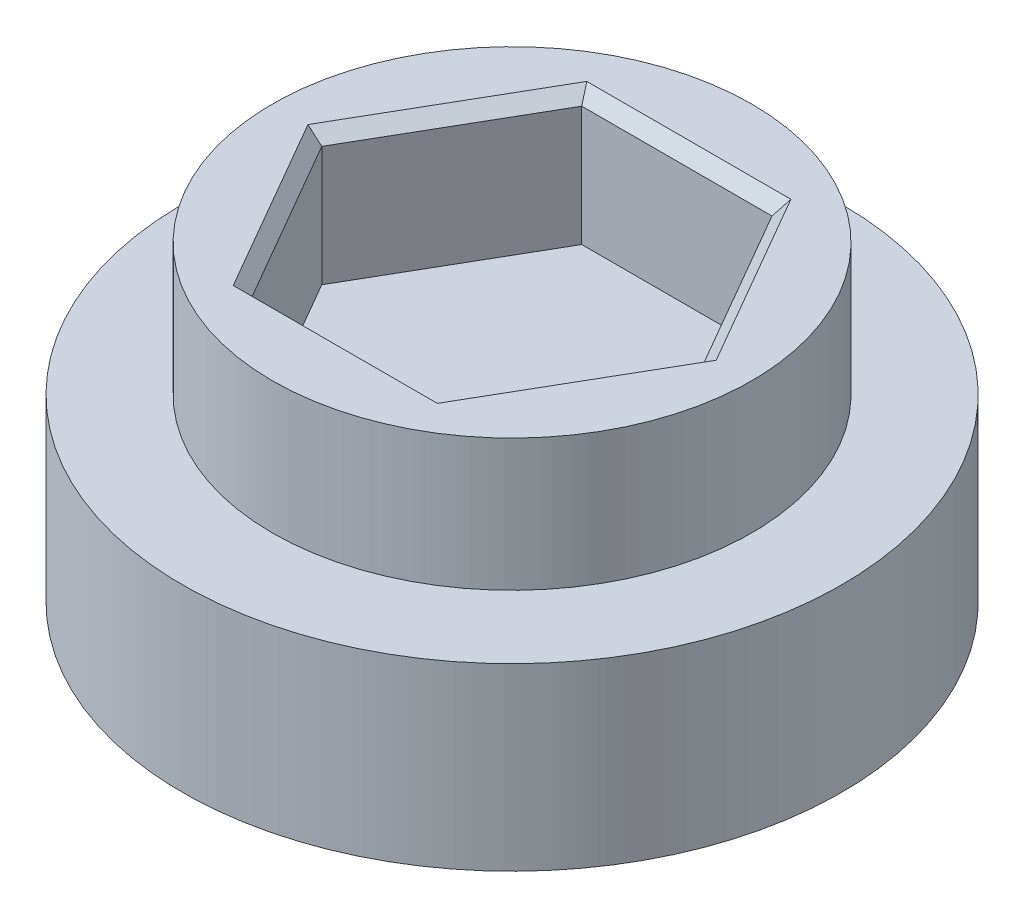
ISO-10303-21;
HEADER;
FILE_DESCRIPTION(('STEP AP214'),'2;1');
FILE_NAME('part.step','',(''),(''),'','','');
FILE_SCHEMA(('AUTOMOTIVE_DESIGN { 1 0 10303 214 1 1 1 1 }'));
ENDSEC;
DATA;
#1=APPLICATION_CONTEXT('core data for automotive mechanical design processes');
#2=APPLICATION_PROTOCOL_DEFINITION('international standard','automotive_design',2000,#1);
#3=PRODUCT_CONTEXT('',#1,'mechanical');
#4=PRODUCT('Part','Part','',(#3));
#5=PRODUCT_RELATED_PRODUCT_CATEGORY('part','',(#4));
#6=PRODUCT_DEFINITION_FORMATION('','',#4);
#7=PRODUCT_DEFINITION_CONTEXT('part definition',#1,'design');
#8=PRODUCT_DEFINITION('design','',#6,#7);
#9=PRODUCT_DEFINITION_SHAPE('','',#8);
#10=(LENGTH_UNIT() NAMED_UNIT(*) SI_UNIT(.MILLI.,.METRE.));
#11=(NAMED_UNIT(*) PLANE_ANGLE_UNIT() SI_UNIT($,.RADIAN.));
#12=(NAMED_UNIT(*) SI_UNIT($,.STERADIAN.) SOLID_ANGLE_UNIT());
#13=UNCERTAINTY_MEASURE_WITH_UNIT(LENGTH_MEASURE(1.E-05),#10,'distance_accuracy_value','');
#14=(GEOMETRIC_REPRESENTATION_CONTEXT(3) GLOBAL_UNCERTAINTY_ASSIGNED_CONTEXT((#13)) GLOBAL_UNIT_ASSIGNED_CONTEXT((#10,
#11,#12)) REPRESENTATION_CONTEXT('',''));
#15=CARTESIAN_POINT('',(0.,0.,0.));
#16=DIRECTION('',(0.,0.,1.));
#17=DIRECTION('',(1.,0.,0.));
#18=AXIS2_PLACEMENT_3D('',#15,#16,#17);
#19=CARTESIAN_POINT('',(0.,22.,0.));
#20=DIRECTION('',(0.,1.,0.));
#21=DIRECTION('',(0.,0.,1.));
#22=AXIS2_PLACEMENT_3D('',#19,#20,#21);
#23=PLANE('',#22);
#24=DIRECTION('',(-1.,0.,0.));
#25=VECTOR('',#24,1.);
#26=CARTESIAN_POINT('',(1.45041645805347E-13,22.,29.4999999999999));
#27=LINE('',#26,#25);
#28=CARTESIAN_POINT('',(17.0318329410947,22.,29.4999999999999));
#29=VERTEX_POINT('',#28);
#30=CARTESIAN_POINT('',(-17.0318329410941,22.,29.5));
#31=VERTEX_POINT('',#30);
#32=EDGE_CURVE('E153',#29,#31,#27,.T.);
#33=ORIENTED_EDGE('',*,*,#32,.T.);
#34=DIRECTION('',(-0.499999999999992,0.,-0.866025403784443));
#35=VECTOR('',#34,1.);
#36=CARTESIAN_POINT('',(-25.5477494116411,22.,14.7499999999998));
#37=LINE('',#36,#35);
#38=CARTESIAN_POINT('',(-34.063665882188,22.,-3.58368572086117E-13));
#39=VERTEX_POINT('',#38);
#40=EDGE_CURVE('E155',#31,#39,#37,.T.);
#41=ORIENTED_EDGE('',*,*,#40,.T.);
#42=DIRECTION('',(0.50000000000001,0.,-0.866025403784433));
#43=VECTOR('',#42,1.);
#44=CARTESIAN_POINT('',(-25.5477494116408,22.,-14.7500000000003));
#45=LINE('',#44,#43);
#46=CARTESIAN_POINT('',(-17.0318329410937,22.,-29.5));
#47=VERTEX_POINT('',#46);
#48=EDGE_CURVE('E145',#39,#47,#45,.T.);
#49=ORIENTED_EDGE('',*,*,#48,.T.);
#50=DIRECTION('',(1.,0.,0.));
#51=VECTOR('',#50,1.);
#52=CARTESIAN_POINT('',(0.,22.,-29.5));
#53=LINE('',#52,#51);
#54=CARTESIAN_POINT('',(17.031832941094,22.,-29.5));
#55=VERTEX_POINT('',#54);
#56=EDGE_CURVE('E147',#47,#55,#53,.T.);
#57=ORIENTED_EDGE('',*,*,#56,.T.);
#58=DIRECTION('',(0.499999999999988,0.,0.866025403784446));
#59=VECTOR('',#58,1.);
#60=CARTESIAN_POINT('',(25.547749411641,22.,-14.7499999999995));
#61=LINE('',#60,#59);
#62=CARTESIAN_POINT('',(34.0636658821873,22.,-2.71746413941701E-13));
#63=VERTEX_POINT('',#62);
#64=EDGE_CURVE('E149',#55,#63,#61,.T.);
#65=ORIENTED_EDGE('',*,*,#64,.T.);
#66=DIRECTION('',(-0.499999999999968,0.,0.866025403784457));
#67=VECTOR('',#66,1.);
#68=CARTESIAN_POINT('',(25.5477494116414,22.,14.749999999999));
#69=LINE('',#68,#67);
#70=EDGE_CURVE('E151',#63,#29,#69,.T.);
#71=ORIENTED_EDGE('',*,*,#70,.T.);
#72=EDGE_LOOP('',(#33,#41,#49,#57,#65,#71));
#73=FACE_BOUND('',#72,.T.);
#74=CARTESIAN_POINT('',(0.,22.,0.));
#75=DIRECTION('',(0.,1.,0.));
#76=DIRECTION('',(0.,0.,1.));
#77=AXIS2_PLACEMENT_3D('',#74,#75,#76);
#78=CIRCLE('',#77,40.);
#79=CARTESIAN_POINT('',(0.,22.,40.));
#80=VERTEX_POINT('',#79);
#81=EDGE_CURVE('E139',#80,#80,#78,.T.);
#82=ORIENTED_EDGE('',*,*,#81,.T.);
#83=EDGE_LOOP('',(#82));
#84=FACE_BOUND('',#83,.T.);
#85=ADVANCED_FACE('F32',(#73,#84),#23,.T.);
#86=CARTESIAN_POINT('',(0.,22.,0.));
#87=DIRECTION('',(0.,-1.,0.));
#88=DIRECTION('',(0.,0.,-1.));
#89=AXIS2_PLACEMENT_3D('',#86,#87,#88);
#90=CYLINDRICAL_SURFACE('',#89,40.);
#91=ORIENTED_EDGE('',*,*,#81,.F.);
#92=EDGE_LOOP('',(#91));
#93=FACE_BOUND('',#92,.T.);
#94=CARTESIAN_POINT('',(0.,0.,0.));
#95=DIRECTION('',(0.,-1.,0.));
#96=DIRECTION('',(0.,0.,-1.));
#97=AXIS2_PLACEMENT_3D('',#94,#95,#96);
#98=CIRCLE('',#97,40.);
#99=CARTESIAN_POINT('',(0.,0.,-40.));
#100=VERTEX_POINT('',#99);
#101=EDGE_CURVE('E167',#100,#100,#98,.T.);
#102=ORIENTED_EDGE('',*,*,#101,.F.);
#103=EDGE_LOOP('',(#102));
#104=FACE_BOUND('',#103,.T.);
#105=ADVANCED_FACE('F221',(#93,#104),#90,.T.);
#106=CARTESIAN_POINT('',(-31.7542648054294,22.,-3.24393290007663E-13));
#107=DIRECTION('',(0.866025403784433,0.,0.50000000000001));
#108=DIRECTION('',(0.50000000000001,0.,-0.866025403784433));
#109=AXIS2_PLACEMENT_3D('',#106,#107,#108);
#110=PLANE('',#109);
#111=DIRECTION('',(0.,-1.,0.));
#112=VECTOR('',#111,1.);
#113=CARTESIAN_POINT('',(-15.8771324027145,22.,-27.5));
#114=LINE('',#113,#112);
#115=CARTESIAN_POINT('',(-15.8771324027145,20.,-27.5));
#116=VERTEX_POINT('',#115);
#117=CARTESIAN_POINT('',(-15.8771324027145,0.,-27.5));
#118=VERTEX_POINT('',#117);
#119=EDGE_CURVE('E106',#116,#118,#114,.T.);
#120=ORIENTED_EDGE('',*,*,#119,.F.);
#121=DIRECTION('',(-0.50000000000001,0.,0.866025403784433));
#122=VECTOR('',#121,1.);
#123=CARTESIAN_POINT('',(-31.7542648054294,20.,-3.24393290007663E-13));
#124=LINE('',#123,#122);
#125=CARTESIAN_POINT('',(-31.7542648054294,20.,-3.24393290007663E-13));
#126=VERTEX_POINT('',#125);
#127=EDGE_CURVE('E11',#116,#126,#124,.T.);
#128=ORIENTED_EDGE('',*,*,#127,.T.);
#129=DIRECTION('',(0.,-1.,0.));
#130=VECTOR('',#129,1.);
#131=CARTESIAN_POINT('',(-31.7542648054294,22.,-3.24393290007663E-13));
#132=LINE('',#131,#130);
#133=CARTESIAN_POINT('',(-31.7542648054294,0.,-3.24393290007663E-13));
#134=VERTEX_POINT('',#133);
#135=EDGE_CURVE('E109',#126,#134,#132,.T.);
#136=ORIENTED_EDGE('',*,*,#135,.T.);
#137=DIRECTION('',(-0.50000000000001,0.,0.866025403784433));
#138=VECTOR('',#137,1.);
#139=CARTESIAN_POINT('',(-31.7542648054294,0.,-3.24393290007663E-13));
#140=LINE('',#139,#138);
#141=EDGE_CURVE('E104',#118,#134,#140,.T.);
#142=ORIENTED_EDGE('',*,*,#141,.F.);
#143=EDGE_LOOP('',(#120,#128,#136,#142));
#144=FACE_BOUND('',#143,.T.);
#145=ADVANCED_FACE('F105',(#144),#110,.T.);
#146=CARTESIAN_POINT('',(-15.8771324027149,22.,27.5));
#147=DIRECTION('',(0.866025403784443,0.,-0.499999999999992));
#148=DIRECTION('',(-0.499999999999992,0.,-0.866025403784443));
#149=AXIS2_PLACEMENT_3D('',#146,#147,#148);
#150=PLANE('',#149);
#151=ORIENTED_EDGE('',*,*,#135,.F.);
#152=DIRECTION('',(0.499999999999992,0.,0.866025403784443));
#153=VECTOR('',#152,1.);
#154=CARTESIAN_POINT('',(-15.8771324027149,20.,27.5));
#155=LINE('',#154,#153);
#156=CARTESIAN_POINT('',(-15.8771324027149,20.,27.5));
#157=VERTEX_POINT('',#156);
#158=EDGE_CURVE('E142',#126,#157,#155,.T.);
#159=ORIENTED_EDGE('',*,*,#158,.T.);
#160=DIRECTION('',(0.,-1.,0.));
#161=VECTOR('',#160,1.);
#162=CARTESIAN_POINT('',(-15.8771324027149,22.,27.5));
#163=LINE('',#162,#161);
#164=CARTESIAN_POINT('',(-15.8771324027149,0.,27.5));
#165=VERTEX_POINT('',#164);
#166=EDGE_CURVE('E136',#157,#165,#163,.T.);
#167=ORIENTED_EDGE('',*,*,#166,.T.);
#168=DIRECTION('',(0.499999999999992,0.,0.866025403784443));
#169=VECTOR('',#168,1.);
#170=CARTESIAN_POINT('',(-15.8771324027149,0.,27.5));
#171=LINE('',#170,#169);
#172=EDGE_CURVE('E114',#134,#165,#171,.T.);
#173=ORIENTED_EDGE('',*,*,#172,.F.);
#174=EDGE_LOOP('',(#151,#159,#167,#173));
#175=FACE_BOUND('',#174,.T.);
#176=ADVANCED_FACE('F198',(#175),#150,.T.);
#177=CARTESIAN_POINT('',(15.8771324027154,22.,27.4999999999998));
#178=DIRECTION('',(0.,0.,-1.));
#179=DIRECTION('',(-1.,0.,0.));
#180=AXIS2_PLACEMENT_3D('',#177,#178,#179);
#181=PLANE('',#180);
#182=ORIENTED_EDGE('',*,*,#166,.F.);
#183=DIRECTION('',(1.,0.,0.));
#184=VECTOR('',#183,1.);
#185=CARTESIAN_POINT('',(15.8771324027154,20.,27.4999999999998));
#186=LINE('',#185,#184);
#187=CARTESIAN_POINT('',(15.8771324027154,20.,27.4999999999998));
#188=VERTEX_POINT('',#187);
#189=EDGE_CURVE('E158',#157,#188,#186,.T.);
#190=ORIENTED_EDGE('',*,*,#189,.T.);
#191=DIRECTION('',(0.,-1.,0.));
#192=VECTOR('',#191,1.);
#193=CARTESIAN_POINT('',(15.8771324027154,22.,27.4999999999998));
#194=LINE('',#193,#192);
#195=CARTESIAN_POINT('',(15.8771324027154,0.,27.4999999999998));
#196=VERTEX_POINT('',#195);
#197=EDGE_CURVE('E134',#188,#196,#194,.T.);
#198=ORIENTED_EDGE('',*,*,#197,.T.);
#199=DIRECTION('',(1.,0.,0.));
#200=VECTOR('',#199,1.);
#201=CARTESIAN_POINT('',(15.8771324027154,0.,27.4999999999998));
#202=LINE('',#201,#200);
#203=EDGE_CURVE('E202',#165,#196,#202,.T.);
#204=ORIENTED_EDGE('',*,*,#203,.F.);
#205=EDGE_LOOP('',(#182,#190,#198,#204));
#206=FACE_BOUND('',#205,.T.);
#207=ADVANCED_FACE('F218',(#206),#181,.T.);
#208=CARTESIAN_POINT('',(31.7542648054288,22.,-2.39483014813458E-13));
#209=DIRECTION('',(-0.866025403784457,0.,-0.499999999999968));
#210=DIRECTION('',(-0.499999999999968,0.,0.866025403784457));
#211=AXIS2_PLACEMENT_3D('',#208,#209,#210);
#212=PLANE('',#211);
#213=ORIENTED_EDGE('',*,*,#197,.F.);
#214=DIRECTION('',(0.499999999999968,0.,-0.866025403784457));
#215=VECTOR('',#214,1.);
#216=CARTESIAN_POINT('',(31.7542648054288,20.,-2.39483014813458E-13));
#217=LINE('',#216,#215);
#218=CARTESIAN_POINT('',(31.7542648054288,20.,-2.39483014813458E-13));
#219=VERTEX_POINT('',#218);
#220=EDGE_CURVE('E160',#188,#219,#217,.T.);
#221=ORIENTED_EDGE('',*,*,#220,.T.);
#222=DIRECTION('',(0.,-1.,0.));
#223=VECTOR('',#222,1.);
#224=CARTESIAN_POINT('',(31.7542648054288,22.,-2.39483014813458E-13));
#225=LINE('',#224,#223);
#226=CARTESIAN_POINT('',(31.7542648054288,0.,-2.39483014813458E-13));
#227=VERTEX_POINT('',#226);
#228=EDGE_CURVE('E132',#219,#227,#225,.T.);
#229=ORIENTED_EDGE('',*,*,#228,.T.);
#230=DIRECTION('',(0.499999999999968,0.,-0.866025403784457));
#231=VECTOR('',#230,1.);
#232=CARTESIAN_POINT('',(31.7542648054288,0.,-2.39483014813458E-13));
#233=LINE('',#232,#231);
#234=EDGE_CURVE('E127',#196,#227,#233,.T.);
#235=ORIENTED_EDGE('',*,*,#234,.F.);
#236=EDGE_LOOP('',(#213,#221,#229,#235));
#237=FACE_BOUND('',#236,.T.);
#238=ADVANCED_FACE('F209',(#237),#212,.T.);
#239=CARTESIAN_POINT('',(15.8771324027147,22.,-27.5));
#240=DIRECTION('',(-0.866025403784446,0.,0.499999999999988));
#241=DIRECTION('',(0.499999999999988,0.,0.866025403784446));
#242=AXIS2_PLACEMENT_3D('',#239,#240,#241);
#243=PLANE('',#242);
#244=ORIENTED_EDGE('',*,*,#228,.F.);
#245=DIRECTION('',(-0.499999999999988,0.,-0.866025403784446));
#246=VECTOR('',#245,1.);
#247=CARTESIAN_POINT('',(15.8771324027147,20.,-27.5));
#248=LINE('',#247,#246);
#249=CARTESIAN_POINT('',(15.8771324027147,20.,-27.5));
#250=VERTEX_POINT('',#249);
#251=EDGE_CURVE('E56',#219,#250,#248,.T.);
#252=ORIENTED_EDGE('',*,*,#251,.T.);
#253=DIRECTION('',(0.,-1.,0.));
#254=VECTOR('',#253,1.);
#255=CARTESIAN_POINT('',(15.8771324027147,22.,-27.5));
#256=LINE('',#255,#254);
#257=CARTESIAN_POINT('',(15.8771324027147,0.,-27.5));
#258=VERTEX_POINT('',#257);
#259=EDGE_CURVE('E120',#250,#258,#256,.T.);
#260=ORIENTED_EDGE('',*,*,#259,.T.);
#261=DIRECTION('',(-0.499999999999988,0.,-0.866025403784446));
#262=VECTOR('',#261,1.);
#263=CARTESIAN_POINT('',(15.8771324027147,0.,-27.5));
#264=LINE('',#263,#262);
#265=EDGE_CURVE('E125',#227,#258,#264,.T.);
#266=ORIENTED_EDGE('',*,*,#265,.F.);
#267=EDGE_LOOP('',(#244,#252,#260,#266));
#268=FACE_BOUND('',#267,.T.);
#269=ADVANCED_FACE('F210',(#268),#243,.T.);
#270=CARTESIAN_POINT('',(-15.8771324027145,22.,-27.5));
#271=DIRECTION('',(0.,0.,1.));
#272=DIRECTION('',(1.,0.,0.));
#273=AXIS2_PLACEMENT_3D('',#270,#271,#272);
#274=PLANE('',#273);
#275=ORIENTED_EDGE('',*,*,#259,.F.);
#276=DIRECTION('',(-1.,0.,0.));
#277=VECTOR('',#276,1.);
#278=CARTESIAN_POINT('',(-15.8771324027145,20.,-27.5));
#279=LINE('',#278,#277);
#280=EDGE_CURVE('E41',#250,#116,#279,.T.);
#281=ORIENTED_EDGE('',*,*,#280,.T.);
#282=ORIENTED_EDGE('',*,*,#119,.T.);
#283=DIRECTION('',(-1.,0.,0.));
#284=VECTOR('',#283,1.);
#285=CARTESIAN_POINT('',(-15.8771324027145,0.,-27.5));
#286=LINE('',#285,#284);
#287=EDGE_CURVE('E118',#258,#118,#286,.T.);
#288=ORIENTED_EDGE('',*,*,#287,.F.);
#289=EDGE_LOOP('',(#275,#281,#282,#288));
#290=FACE_BOUND('',#289,.T.);
#291=ADVANCED_FACE('F117',(#290),#274,.T.);
#292=CARTESIAN_POINT('',(15.8771324027147,20.,-27.5));
#293=DIRECTION('',(0.612372435695798,-0.707106781186549,-0.353553390593264));
#294=DIRECTION('',(-0.499999999999988,0.,-0.866025403784446));
#295=AXIS2_PLACEMENT_3D('',#292,#293,#294);
#296=PLANE('',#295);
#297=DIRECTION('',(0.755928946018451,0.654653670707982,0.));
#298=VECTOR('',#297,1.);
#299=CARTESIAN_POINT('',(31.7542648054288,20.,-2.39483014813458E-13));
#300=LINE('',#299,#298);
#301=EDGE_CURVE('E174',#63,#219,#300,.F.);
#302=ORIENTED_EDGE('',*,*,#301,.F.);
#303=ORIENTED_EDGE('',*,*,#64,.F.);
#304=DIRECTION('',(0.377964473009233,0.654653670707974,-0.654653670707977));
#305=VECTOR('',#304,1.);
#306=CARTESIAN_POINT('',(15.8771324027147,20.,-27.5));
#307=LINE('',#306,#305);
#308=EDGE_CURVE('E36',#250,#55,#307,.T.);
#309=ORIENTED_EDGE('',*,*,#308,.F.);
#310=ORIENTED_EDGE('',*,*,#251,.F.);
#311=EDGE_LOOP('',(#302,#303,#309,#310));
#312=FACE_BOUND('',#311,.T.);
#313=ADVANCED_FACE('F34',(#312),#296,.F.);
#314=CARTESIAN_POINT('',(-15.8771324027145,20.,-27.5));
#315=DIRECTION('',(0.,-0.707106781186549,-0.707106781186546));
#316=DIRECTION('',(-1.,0.,0.));
#317=AXIS2_PLACEMENT_3D('',#314,#315,#316);
#318=PLANE('',#317);
#319=ORIENTED_EDGE('',*,*,#308,.T.);
#320=ORIENTED_EDGE('',*,*,#56,.F.);
#321=DIRECTION('',(-0.377964473009224,0.654653670707977,-0.65465367070798));
#322=VECTOR('',#321,1.);
#323=CARTESIAN_POINT('',(-15.8771324027145,20.,-27.5));
#324=LINE('',#323,#322);
#325=EDGE_CURVE('E172',#116,#47,#324,.T.);
#326=ORIENTED_EDGE('',*,*,#325,.F.);
#327=ORIENTED_EDGE('',*,*,#280,.F.);
#328=EDGE_LOOP('',(#319,#320,#326,#327));
#329=FACE_BOUND('',#328,.T.);
#330=ADVANCED_FACE('F184',(#329),#318,.F.);
#331=CARTESIAN_POINT('',(31.7542648054288,20.,-2.39483014813458E-13));
#332=DIRECTION('',(0.612372435695807,-0.707106781186548,0.353553390593251));
#333=DIRECTION('',(0.499999999999968,0.,-0.866025403784457));
#334=AXIS2_PLACEMENT_3D('',#331,#332,#333);
#335=PLANE('',#334);
#336=ORIENTED_EDGE('',*,*,#301,.T.);
#337=ORIENTED_EDGE('',*,*,#220,.F.);
#338=DIRECTION('',(0.37796447300924,0.654653670707972,0.654653670707974));
#339=VECTOR('',#338,1.);
#340=CARTESIAN_POINT('',(15.8771324027154,20.,27.4999999999998));
#341=LINE('',#340,#339);
#342=EDGE_CURVE('E169',#29,#188,#341,.F.);
#343=ORIENTED_EDGE('',*,*,#342,.F.);
#344=ORIENTED_EDGE('',*,*,#70,.F.);
#345=EDGE_LOOP('',(#336,#337,#343,#344));
#346=FACE_BOUND('',#345,.T.);
#347=ADVANCED_FACE('F241',(#346),#335,.F.);
#348=CARTESIAN_POINT('',(-31.7542648054294,20.,-3.24393290007663E-13));
#349=DIRECTION('',(-0.612372435695789,-0.707106781186549,-0.35355339059328));
#350=DIRECTION('',(-0.50000000000001,0.,0.866025403784433));
#351=AXIS2_PLACEMENT_3D('',#348,#349,#350);
#352=PLANE('',#351);
#353=ORIENTED_EDGE('',*,*,#325,.T.);
#354=ORIENTED_EDGE('',*,*,#48,.F.);
#355=DIRECTION('',(0.755928946018456,-0.654653670707975,0.));
#356=VECTOR('',#355,1.);
#357=CARTESIAN_POINT('',(-22.6816177181638,12.1428571428571,-2.32452945780892E-13));
#358=LINE('',#357,#356);
#359=EDGE_CURVE('E166',#126,#39,#358,.F.);
#360=ORIENTED_EDGE('',*,*,#359,.F.);
#361=ORIENTED_EDGE('',*,*,#127,.F.);
#362=EDGE_LOOP('',(#353,#354,#360,#361));
#363=FACE_BOUND('',#362,.T.);
#364=ADVANCED_FACE('F194',(#363),#352,.F.);
#365=CARTESIAN_POINT('',(15.8771324027154,20.,27.4999999999998));
#366=DIRECTION('',(0.,-0.70710678118655,0.707106781186545));
#367=DIRECTION('',(1.,0.,0.));
#368=AXIS2_PLACEMENT_3D('',#365,#366,#367);
#369=PLANE('',#368);
#370=ORIENTED_EDGE('',*,*,#342,.T.);
#371=ORIENTED_EDGE('',*,*,#189,.F.);
#372=DIRECTION('',(-0.377964473009229,0.654653670707974,0.654653670707979));
#373=VECTOR('',#372,1.);
#374=CARTESIAN_POINT('',(-15.8771324027149,20.,27.5));
#375=LINE('',#374,#373);
#376=EDGE_CURVE('E164',#31,#157,#375,.F.);
#377=ORIENTED_EDGE('',*,*,#376,.F.);
#378=ORIENTED_EDGE('',*,*,#32,.F.);
#379=EDGE_LOOP('',(#370,#371,#377,#378));
#380=FACE_BOUND('',#379,.T.);
#381=ADVANCED_FACE('F234',(#380),#369,.F.);
#382=CARTESIAN_POINT('',(-15.8771324027149,20.,27.5));
#383=DIRECTION('',(-0.612372435695796,-0.707106781186549,0.353553390593267));
#384=DIRECTION('',(0.499999999999992,0.,0.866025403784443));
#385=AXIS2_PLACEMENT_3D('',#382,#383,#384);
#386=PLANE('',#385);
#387=ORIENTED_EDGE('',*,*,#359,.T.);
#388=ORIENTED_EDGE('',*,*,#40,.F.);
#389=ORIENTED_EDGE('',*,*,#376,.T.);
#390=ORIENTED_EDGE('',*,*,#158,.F.);
#391=EDGE_LOOP('',(#387,#388,#389,#390));
#392=FACE_BOUND('',#391,.T.);
#393=ADVANCED_FACE('F231',(#392),#386,.F.);
#394=CARTESIAN_POINT('',(0.,0.,0.));
#395=DIRECTION('',(0.,-1.,0.));
#396=DIRECTION('',(0.,0.,-1.));
#397=AXIS2_PLACEMENT_3D('',#394,#395,#396);
#398=PLANE('',#397);
#399=ORIENTED_EDGE('',*,*,#141,.T.);
#400=ORIENTED_EDGE('',*,*,#172,.T.);
#401=ORIENTED_EDGE('',*,*,#203,.T.);
#402=ORIENTED_EDGE('',*,*,#234,.T.);
#403=ORIENTED_EDGE('',*,*,#265,.T.);
#404=ORIENTED_EDGE('',*,*,#287,.T.);
#405=EDGE_LOOP('',(#399,#400,#401,#402,#403,#404));
#406=FACE_BOUND('',#405,.T.);
#407=ADVANCED_FACE('F122',(#406),#398,.F.);
#408=CARTESIAN_POINT('',(0.,0.,0.));
#409=DIRECTION('',(0.,-1.,0.));
#410=DIRECTION('',(0.,0.,-1.));
#411=AXIS2_PLACEMENT_3D('',#408,#409,#410);
#412=CIRCLE('',#411,55.);
#413=CARTESIAN_POINT('',(0.,0.,-55.));
#414=VERTEX_POINT('',#413);
#415=EDGE_CURVE('E301',#414,#414,#412,.T.);
#416=ORIENTED_EDGE('',*,*,#415,.F.);
#417=EDGE_LOOP('',(#416));
#418=FACE_BOUND('',#417,.T.);
#419=ORIENTED_EDGE('',*,*,#101,.T.);
#420=EDGE_LOOP('',(#419));
#421=FACE_BOUND('',#420,.T.);
#422=ADVANCED_FACE('F265',(#418,#421),#398,.F.);
#423=CARTESIAN_POINT('',(0.,-30.,0.));
#424=DIRECTION('',(0.,1.,0.));
#425=DIRECTION('',(0.,0.,1.));
#426=AXIS2_PLACEMENT_3D('',#423,#424,#425);
#427=CYLINDRICAL_SURFACE('',#426,55.);
#428=CARTESIAN_POINT('',(0.,-30.,0.));
#429=DIRECTION('',(0.,-1.,0.));
#430=DIRECTION('',(0.,0.,-1.));
#431=AXIS2_PLACEMENT_3D('',#428,#429,#430);
#432=CIRCLE('',#431,55.);
#433=CARTESIAN_POINT('',(0.,-30.,-55.));
#434=VERTEX_POINT('',#433);
#435=EDGE_CURVE('E300',#434,#434,#432,.T.);
#436=ORIENTED_EDGE('',*,*,#435,.F.);
#437=EDGE_LOOP('',(#436));
#438=FACE_BOUND('',#437,.T.);
#439=ORIENTED_EDGE('',*,*,#415,.T.);
#440=EDGE_LOOP('',(#439));
#441=FACE_BOUND('',#440,.T.);
#442=ADVANCED_FACE('F275',(#438,#441),#427,.T.);
#443=CARTESIAN_POINT('',(0.,-30.,0.));
#444=DIRECTION('',(0.,-1.,0.));
#445=DIRECTION('',(0.,0.,-1.));
#446=AXIS2_PLACEMENT_3D('',#443,#444,#445);
#447=PLANE('',#446);
#448=ORIENTED_EDGE('',*,*,#435,.T.);
#449=EDGE_LOOP('',(#448));
#450=FACE_BOUND('',#449,.T.);
#451=ADVANCED_FACE('F284',(#450),#447,.T.);
#452=CLOSED_SHELL('',(#85,#105,#145,#176,#207,#238,#269,#291,#313,#330,#347,#364,#381,#393,#407,
#422,#442,#451));
#453=MANIFOLD_SOLID_BREP('B2',#452);
#454=ADVANCED_BREP_SHAPE_REPRESENTATION('',(#18,#453),#14);
#455=SHAPE_DEFINITION_REPRESENTATION(#9,#454);
ENDSEC;
END-ISO-10303-21;
